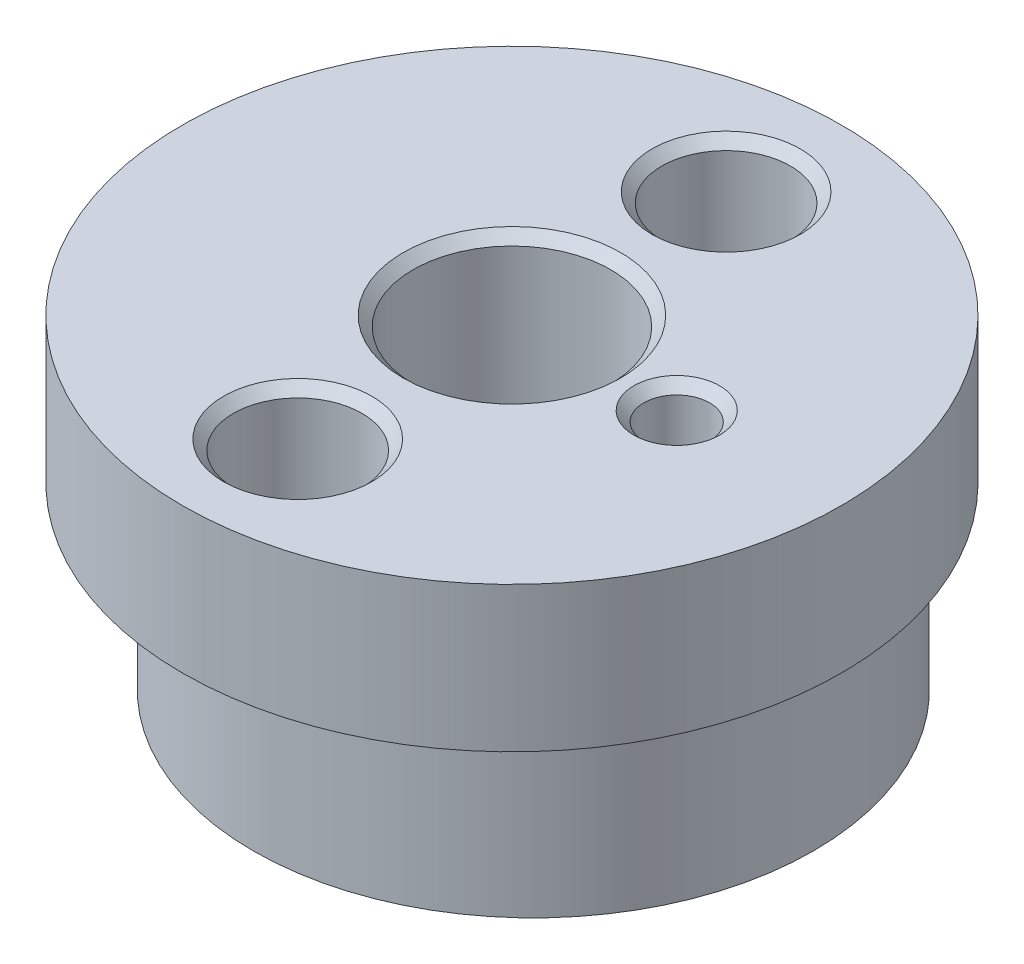
ISO-10303-21;
HEADER;
FILE_DESCRIPTION(('STEP AP214'),'2;1');
FILE_NAME('part.step','',(''),(''),'','','');
FILE_SCHEMA(('AUTOMOTIVE_DESIGN { 1 0 10303 214 1 1 1 1 }'));
ENDSEC;
DATA;
#1=APPLICATION_CONTEXT('core data for automotive mechanical design processes');
#2=APPLICATION_PROTOCOL_DEFINITION('international standard','automotive_design',2000,#1);
#3=PRODUCT_CONTEXT('',#1,'mechanical');
#4=PRODUCT('Part','Part','',(#3));
#5=PRODUCT_RELATED_PRODUCT_CATEGORY('part','',(#4));
#6=PRODUCT_DEFINITION_FORMATION('','',#4);
#7=PRODUCT_DEFINITION_CONTEXT('part definition',#1,'design');
#8=PRODUCT_DEFINITION('design','',#6,#7);
#9=PRODUCT_DEFINITION_SHAPE('','',#8);
#10=(LENGTH_UNIT() NAMED_UNIT(*) SI_UNIT(.MILLI.,.METRE.));
#11=(NAMED_UNIT(*) PLANE_ANGLE_UNIT() SI_UNIT($,.RADIAN.));
#12=(NAMED_UNIT(*) SI_UNIT($,.STERADIAN.) SOLID_ANGLE_UNIT());
#13=UNCERTAINTY_MEASURE_WITH_UNIT(LENGTH_MEASURE(1.E-05),#10,'distance_accuracy_value','');
#14=(GEOMETRIC_REPRESENTATION_CONTEXT(3) GLOBAL_UNCERTAINTY_ASSIGNED_CONTEXT((#13)) GLOBAL_UNIT_ASSIGNED_CONTEXT((#10,
#11,#12)) REPRESENTATION_CONTEXT('',''));
#15=CARTESIAN_POINT('',(0.,0.,0.));
#16=DIRECTION('',(0.,0.,1.));
#17=DIRECTION('',(1.,0.,0.));
#18=AXIS2_PLACEMENT_3D('',#15,#16,#17);
#19=CARTESIAN_POINT('',(-0.65,0.,6.5));
#20=DIRECTION('',(0.,-1.,0.));
#21=DIRECTION('',(0.,0.,-1.));
#22=AXIS2_PLACEMENT_3D('',#19,#20,#21);
#23=CYLINDRICAL_SURFACE('',#22,1.6);
#24=CARTESIAN_POINT('',(-0.65,0.299999999999999,6.5));
#25=DIRECTION('',(0.,1.,0.));
#26=DIRECTION('',(0.,0.,1.));
#27=AXIS2_PLACEMENT_3D('',#24,#25,#26);
#28=CIRCLE('',#27,1.6);
#29=CARTESIAN_POINT('',(-0.65,0.299999999999999,8.1));
#30=VERTEX_POINT('',#29);
#31=EDGE_CURVE('E64',#30,#30,#28,.F.);
#32=ORIENTED_EDGE('',*,*,#31,.T.);
#33=EDGE_LOOP('',(#32));
#34=FACE_BOUND('',#33,.T.);
#35=CARTESIAN_POINT('',(-0.65,5.5,6.5));
#36=DIRECTION('',(0.,1.,0.));
#37=DIRECTION('',(0.,0.,1.));
#38=AXIS2_PLACEMENT_3D('',#35,#36,#37);
#39=CIRCLE('',#38,1.6);
#40=CARTESIAN_POINT('',(-0.65,5.5,8.1));
#41=VERTEX_POINT('',#40);
#42=EDGE_CURVE('E92',#41,#41,#39,.F.);
#43=ORIENTED_EDGE('',*,*,#42,.F.);
#44=EDGE_LOOP('',(#43));
#45=FACE_BOUND('',#44,.T.);
#46=ADVANCED_FACE('F34',(#34,#45),#23,.F.);
#47=CARTESIAN_POINT('',(-0.65,0.,-6.5));
#48=DIRECTION('',(0.,-1.,0.));
#49=DIRECTION('',(0.,0.,-1.));
#50=AXIS2_PLACEMENT_3D('',#47,#48,#49);
#51=CYLINDRICAL_SURFACE('',#50,1.6);
#52=CARTESIAN_POINT('',(-0.65,0.299999999999999,-6.5));
#53=DIRECTION('',(0.,1.,0.));
#54=DIRECTION('',(0.,0.,1.));
#55=AXIS2_PLACEMENT_3D('',#52,#53,#54);
#56=CIRCLE('',#55,1.6);
#57=CARTESIAN_POINT('',(-0.65,0.299999999999999,-4.9));
#58=VERTEX_POINT('',#57);
#59=EDGE_CURVE('E46',#58,#58,#56,.F.);
#60=ORIENTED_EDGE('',*,*,#59,.T.);
#61=EDGE_LOOP('',(#60));
#62=FACE_BOUND('',#61,.T.);
#63=CARTESIAN_POINT('',(-0.65,5.5,-6.5));
#64=DIRECTION('',(0.,1.,0.));
#65=DIRECTION('',(0.,0.,1.));
#66=AXIS2_PLACEMENT_3D('',#63,#64,#65);
#67=CIRCLE('',#66,1.6);
#68=CARTESIAN_POINT('',(-0.65,5.5,-4.9));
#69=VERTEX_POINT('',#68);
#70=EDGE_CURVE('E96',#69,#69,#67,.F.);
#71=ORIENTED_EDGE('',*,*,#70,.F.);
#72=EDGE_LOOP('',(#71));
#73=FACE_BOUND('',#72,.T.);
#74=ADVANCED_FACE('F133',(#62,#73),#51,.F.);
#75=CARTESIAN_POINT('',(0.,0.,0.));
#76=DIRECTION('',(0.,1.,0.));
#77=DIRECTION('',(0.,0.,1.));
#78=AXIS2_PLACEMENT_3D('',#75,#76,#77);
#79=PLANE('',#78);
#80=CARTESIAN_POINT('',(-0.65,0.,6.5));
#81=DIRECTION('',(0.,1.,0.));
#82=DIRECTION('',(0.,0.,1.));
#83=AXIS2_PLACEMENT_3D('',#80,#81,#82);
#84=CIRCLE('',#83,1.9);
#85=CARTESIAN_POINT('',(-0.65,0.,8.4));
#86=VERTEX_POINT('',#85);
#87=EDGE_CURVE('E50',#86,#86,#84,.T.);
#88=ORIENTED_EDGE('',*,*,#87,.T.);
#89=EDGE_LOOP('',(#88));
#90=FACE_BOUND('',#89,.T.);
#91=CARTESIAN_POINT('',(-0.65,0.,-6.5));
#92=DIRECTION('',(0.,1.,0.));
#93=DIRECTION('',(0.,0.,1.));
#94=AXIS2_PLACEMENT_3D('',#91,#92,#93);
#95=CIRCLE('',#94,1.9);
#96=CARTESIAN_POINT('',(-0.65,0.,-4.6));
#97=VERTEX_POINT('',#96);
#98=EDGE_CURVE('E55',#97,#97,#95,.T.);
#99=ORIENTED_EDGE('',*,*,#98,.T.);
#100=EDGE_LOOP('',(#99));
#101=FACE_BOUND('',#100,.T.);
#102=CARTESIAN_POINT('',(-0.65,0.,0.));
#103=DIRECTION('',(0.,1.,0.));
#104=DIRECTION('',(0.,0.,1.));
#105=AXIS2_PLACEMENT_3D('',#102,#103,#104);
#106=CIRCLE('',#105,3.3);
#107=CARTESIAN_POINT('',(-0.65,0.,3.3));
#108=VERTEX_POINT('',#107);
#109=EDGE_CURVE('E58',#108,#108,#106,.T.);
#110=ORIENTED_EDGE('',*,*,#109,.T.);
#111=EDGE_LOOP('',(#110));
#112=FACE_BOUND('',#111,.T.);
#113=CARTESIAN_POINT('',(4.34999999999999,0.,0.));
#114=DIRECTION('',(0.,1.,0.));
#115=DIRECTION('',(0.,0.,1.));
#116=AXIS2_PLACEMENT_3D('',#113,#114,#115);
#117=CIRCLE('',#116,1.30000000000001);
#118=CARTESIAN_POINT('',(4.34999999999999,0.,1.30000000000001));
#119=VERTEX_POINT('',#118);
#120=EDGE_CURVE('E61',#119,#119,#117,.T.);
#121=ORIENTED_EDGE('',*,*,#120,.T.);
#122=EDGE_LOOP('',(#121));
#123=FACE_BOUND('',#122,.T.);
#124=CARTESIAN_POINT('',(0.,0.,0.));
#125=DIRECTION('',(0.,1.,0.));
#126=DIRECTION('',(0.,0.,1.));
#127=AXIS2_PLACEMENT_3D('',#124,#125,#126);
#128=CIRCLE('',#127,8.5);
#129=CARTESIAN_POINT('',(0.,0.,8.5));
#130=VERTEX_POINT('',#129);
#131=EDGE_CURVE('E102',#130,#130,#128,.T.);
#132=ORIENTED_EDGE('',*,*,#131,.F.);
#133=EDGE_LOOP('',(#132));
#134=FACE_BOUND('',#133,.T.);
#135=ADVANCED_FACE('F140',(#90,#101,#112,#123,#134),#79,.F.);
#136=CARTESIAN_POINT('',(0.,5.5,0.));
#137=DIRECTION('',(0.,-1.,0.));
#138=DIRECTION('',(0.,0.,-1.));
#139=AXIS2_PLACEMENT_3D('',#136,#137,#138);
#140=CYLINDRICAL_SURFACE('',#139,8.5);
#141=ORIENTED_EDGE('',*,*,#131,.T.);
#142=EDGE_LOOP('',(#141));
#143=FACE_BOUND('',#142,.T.);
#144=CARTESIAN_POINT('',(0.,5.1,0.));
#145=DIRECTION('',(0.,1.,0.));
#146=DIRECTION('',(0.,0.,1.));
#147=AXIS2_PLACEMENT_3D('',#144,#145,#146);
#148=CIRCLE('',#147,8.5);
#149=CARTESIAN_POINT('',(0.,5.1,8.5));
#150=VERTEX_POINT('',#149);
#151=EDGE_CURVE('E91',#150,#150,#148,.T.);
#152=ORIENTED_EDGE('',*,*,#151,.F.);
#153=EDGE_LOOP('',(#152));
#154=FACE_BOUND('',#153,.T.);
#155=ADVANCED_FACE('F164',(#143,#154),#140,.T.);
#156=CARTESIAN_POINT('',(-0.65,5.1,0.));
#157=DIRECTION('',(0.,1.,0.));
#158=DIRECTION('',(0.,0.,1.));
#159=AXIS2_PLACEMENT_3D('',#156,#157,#158);
#160=CYLINDRICAL_SURFACE('',#159,10.);
#161=CARTESIAN_POINT('',(-0.65,5.1,0.));
#162=DIRECTION('',(0.,1.,0.));
#163=DIRECTION('',(0.,0.,1.));
#164=AXIS2_PLACEMENT_3D('',#161,#162,#163);
#165=CIRCLE('',#164,10.);
#166=CARTESIAN_POINT('',(-0.65,5.1,10.));
#167=VERTEX_POINT('',#166);
#168=EDGE_CURVE('E105',#167,#167,#165,.T.);
#169=ORIENTED_EDGE('',*,*,#168,.T.);
#170=EDGE_LOOP('',(#169));
#171=FACE_BOUND('',#170,.T.);
#172=CARTESIAN_POINT('',(-0.65,9.5,0.));
#173=DIRECTION('',(0.,1.,0.));
#174=DIRECTION('',(0.,0.,1.));
#175=AXIS2_PLACEMENT_3D('',#172,#173,#174);
#176=CIRCLE('',#175,10.);
#177=CARTESIAN_POINT('',(-0.65,9.5,10.));
#178=VERTEX_POINT('',#177);
#179=EDGE_CURVE('E95',#178,#178,#176,.T.);
#180=ORIENTED_EDGE('',*,*,#179,.F.);
#181=EDGE_LOOP('',(#180));
#182=FACE_BOUND('',#181,.T.);
#183=ADVANCED_FACE('F160',(#171,#182),#160,.T.);
#184=CARTESIAN_POINT('',(-0.65,5.1,0.));
#185=DIRECTION('',(0.,1.,0.));
#186=DIRECTION('',(0.,0.,1.));
#187=AXIS2_PLACEMENT_3D('',#184,#185,#186);
#188=PLANE('',#187);
#189=ORIENTED_EDGE('',*,*,#151,.T.);
#190=EDGE_LOOP('',(#189));
#191=FACE_BOUND('',#190,.T.);
#192=ORIENTED_EDGE('',*,*,#168,.F.);
#193=EDGE_LOOP('',(#192));
#194=FACE_BOUND('',#193,.T.);
#195=ADVANCED_FACE('F156',(#191,#194),#188,.F.);
#196=CARTESIAN_POINT('',(-0.65,9.5,0.));
#197=DIRECTION('',(0.,1.,0.));
#198=DIRECTION('',(0.,0.,1.));
#199=AXIS2_PLACEMENT_3D('',#196,#197,#198);
#200=PLANE('',#199);
#201=CARTESIAN_POINT('',(-0.65,9.5,0.));
#202=DIRECTION('',(0.,1.,0.));
#203=DIRECTION('',(0.,0.,1.));
#204=AXIS2_PLACEMENT_3D('',#201,#202,#203);
#205=CIRCLE('',#204,3.30000000000001);
#206=CARTESIAN_POINT('',(-0.65,9.5,3.30000000000001));
#207=VERTEX_POINT('',#206);
#208=EDGE_CURVE('E79',#207,#207,#205,.F.);
#209=ORIENTED_EDGE('',*,*,#208,.T.);
#210=EDGE_LOOP('',(#209));
#211=FACE_BOUND('',#210,.T.);
#212=CARTESIAN_POINT('',(4.34999999999999,9.5,0.));
#213=DIRECTION('',(0.,1.,0.));
#214=DIRECTION('',(0.,0.,1.));
#215=AXIS2_PLACEMENT_3D('',#212,#213,#214);
#216=CIRCLE('',#215,1.30000000000001);
#217=CARTESIAN_POINT('',(4.34999999999999,9.5,1.30000000000001));
#218=VERTEX_POINT('',#217);
#219=EDGE_CURVE('E82',#218,#218,#216,.F.);
#220=ORIENTED_EDGE('',*,*,#219,.T.);
#221=EDGE_LOOP('',(#220));
#222=FACE_BOUND('',#221,.T.);
#223=CARTESIAN_POINT('',(-0.65,9.5,-6.5));
#224=DIRECTION('',(0.,1.,0.));
#225=DIRECTION('',(0.,0.,1.));
#226=AXIS2_PLACEMENT_3D('',#223,#224,#225);
#227=CIRCLE('',#226,2.25);
#228=CARTESIAN_POINT('',(-0.65,9.5,-4.25));
#229=VERTEX_POINT('',#228);
#230=EDGE_CURVE('E85',#229,#229,#227,.F.);
#231=ORIENTED_EDGE('',*,*,#230,.T.);
#232=EDGE_LOOP('',(#231));
#233=FACE_BOUND('',#232,.T.);
#234=CARTESIAN_POINT('',(-0.65,9.5,6.5));
#235=DIRECTION('',(0.,1.,0.));
#236=DIRECTION('',(0.,0.,1.));
#237=AXIS2_PLACEMENT_3D('',#234,#235,#236);
#238=CIRCLE('',#237,2.25);
#239=CARTESIAN_POINT('',(-0.65,9.5,8.75));
#240=VERTEX_POINT('',#239);
#241=EDGE_CURVE('E88',#240,#240,#238,.F.);
#242=ORIENTED_EDGE('',*,*,#241,.T.);
#243=EDGE_LOOP('',(#242));
#244=FACE_BOUND('',#243,.T.);
#245=ORIENTED_EDGE('',*,*,#179,.T.);
#246=EDGE_LOOP('',(#245));
#247=FACE_BOUND('',#246,.T.);
#248=ADVANCED_FACE('F152',(#211,#222,#233,#244,#247),#200,.T.);
#249=CARTESIAN_POINT('',(-0.65,9.5,0.));
#250=DIRECTION('',(0.,-1.,0.));
#251=DIRECTION('',(0.,0.,-1.));
#252=AXIS2_PLACEMENT_3D('',#249,#250,#251);
#253=CYLINDRICAL_SURFACE('',#252,3.);
#254=CARTESIAN_POINT('',(-0.65,9.2,0.));
#255=DIRECTION('',(0.,1.,0.));
#256=DIRECTION('',(0.,0.,1.));
#257=AXIS2_PLACEMENT_3D('',#254,#255,#256);
#258=CIRCLE('',#257,3.);
#259=CARTESIAN_POINT('',(-0.65,9.2,3.));
#260=VERTEX_POINT('',#259);
#261=EDGE_CURVE('E73',#260,#260,#258,.T.);
#262=ORIENTED_EDGE('',*,*,#261,.T.);
#263=EDGE_LOOP('',(#262));
#264=FACE_BOUND('',#263,.T.);
#265=CARTESIAN_POINT('',(-0.65,0.299999999999996,0.));
#266=DIRECTION('',(0.,1.,0.));
#267=DIRECTION('',(0.,0.,1.));
#268=AXIS2_PLACEMENT_3D('',#265,#266,#267);
#269=CIRCLE('',#268,3.);
#270=CARTESIAN_POINT('',(-0.65,0.299999999999996,3.));
#271=VERTEX_POINT('',#270);
#272=EDGE_CURVE('E76',#271,#271,#269,.F.);
#273=ORIENTED_EDGE('',*,*,#272,.T.);
#274=EDGE_LOOP('',(#273));
#275=FACE_BOUND('',#274,.T.);
#276=ADVANCED_FACE('F148',(#264,#275),#253,.F.);
#277=CARTESIAN_POINT('',(4.34999999999999,9.5,0.));
#278=DIRECTION('',(0.,-1.,0.));
#279=DIRECTION('',(0.,0.,-1.));
#280=AXIS2_PLACEMENT_3D('',#277,#278,#279);
#281=CYLINDRICAL_SURFACE('',#280,1.00000000000001);
#282=CARTESIAN_POINT('',(4.34999999999999,9.2,0.));
#283=DIRECTION('',(0.,1.,0.));
#284=DIRECTION('',(0.,0.,1.));
#285=AXIS2_PLACEMENT_3D('',#282,#283,#284);
#286=CIRCLE('',#285,1.00000000000001);
#287=CARTESIAN_POINT('',(4.34999999999999,9.2,1.00000000000001));
#288=VERTEX_POINT('',#287);
#289=EDGE_CURVE('E67',#288,#288,#286,.T.);
#290=ORIENTED_EDGE('',*,*,#289,.T.);
#291=EDGE_LOOP('',(#290));
#292=FACE_BOUND('',#291,.T.);
#293=CARTESIAN_POINT('',(4.34999999999999,0.299999999999993,0.));
#294=DIRECTION('',(0.,1.,0.));
#295=DIRECTION('',(0.,0.,1.));
#296=AXIS2_PLACEMENT_3D('',#293,#294,#295);
#297=CIRCLE('',#296,1.00000000000001);
#298=CARTESIAN_POINT('',(4.34999999999999,0.299999999999993,1.00000000000001));
#299=VERTEX_POINT('',#298);
#300=EDGE_CURVE('E70',#299,#299,#297,.F.);
#301=ORIENTED_EDGE('',*,*,#300,.T.);
#302=EDGE_LOOP('',(#301));
#303=FACE_BOUND('',#302,.T.);
#304=ADVANCED_FACE('F130',(#292,#303),#281,.F.);
#305=CARTESIAN_POINT('',(-0.65,5.5,-6.5));
#306=DIRECTION('',(0.,1.,0.));
#307=DIRECTION('',(0.,0.,1.));
#308=AXIS2_PLACEMENT_3D('',#305,#306,#307);
#309=PLANE('',#308);
#310=CARTESIAN_POINT('',(-0.65,5.5,-6.5));
#311=DIRECTION('',(0.,1.,0.));
#312=DIRECTION('',(0.,0.,1.));
#313=AXIS2_PLACEMENT_3D('',#310,#311,#312);
#314=CIRCLE('',#313,1.95);
#315=CARTESIAN_POINT('',(-0.65,5.5,-4.55));
#316=VERTEX_POINT('',#315);
#317=EDGE_CURVE('E99',#316,#316,#314,.T.);
#318=ORIENTED_EDGE('',*,*,#317,.T.);
#319=EDGE_LOOP('',(#318));
#320=FACE_BOUND('',#319,.T.);
#321=ORIENTED_EDGE('',*,*,#70,.T.);
#322=EDGE_LOOP('',(#321));
#323=FACE_BOUND('',#322,.T.);
#324=ADVANCED_FACE('F116',(#320,#323),#309,.T.);
#325=CARTESIAN_POINT('',(-0.65,5.5,-6.5));
#326=DIRECTION('',(0.,1.,0.));
#327=DIRECTION('',(0.,0.,1.));
#328=AXIS2_PLACEMENT_3D('',#325,#326,#327);
#329=CYLINDRICAL_SURFACE('',#328,1.95);
#330=CARTESIAN_POINT('',(-0.65,9.2,-6.5));
#331=DIRECTION('',(0.,1.,0.));
#332=DIRECTION('',(0.,0.,1.));
#333=AXIS2_PLACEMENT_3D('',#330,#331,#332);
#334=CIRCLE('',#333,1.95);
#335=CARTESIAN_POINT('',(-0.65,9.2,-4.55));
#336=VERTEX_POINT('',#335);
#337=EDGE_CURVE('E42',#336,#336,#334,.T.);
#338=ORIENTED_EDGE('',*,*,#337,.T.);
#339=EDGE_LOOP('',(#338));
#340=FACE_BOUND('',#339,.T.);
#341=ORIENTED_EDGE('',*,*,#317,.F.);
#342=EDGE_LOOP('',(#341));
#343=FACE_BOUND('',#342,.T.);
#344=ADVANCED_FACE('F119',(#340,#343),#329,.F.);
#345=CARTESIAN_POINT('',(-0.65,5.5,6.5));
#346=DIRECTION('',(0.,1.,0.));
#347=DIRECTION('',(0.,0.,1.));
#348=AXIS2_PLACEMENT_3D('',#345,#346,#347);
#349=PLANE('',#348);
#350=CARTESIAN_POINT('',(-0.65,5.5,6.5));
#351=DIRECTION('',(0.,1.,0.));
#352=DIRECTION('',(0.,0.,1.));
#353=AXIS2_PLACEMENT_3D('',#350,#351,#352);
#354=CIRCLE('',#353,1.95);
#355=CARTESIAN_POINT('',(-0.65,5.5,8.45));
#356=VERTEX_POINT('',#355);
#357=EDGE_CURVE('E110',#356,#356,#354,.T.);
#358=ORIENTED_EDGE('',*,*,#357,.T.);
#359=EDGE_LOOP('',(#358));
#360=FACE_BOUND('',#359,.T.);
#361=ORIENTED_EDGE('',*,*,#42,.T.);
#362=EDGE_LOOP('',(#361));
#363=FACE_BOUND('',#362,.T.);
#364=ADVANCED_FACE('F121',(#360,#363),#349,.T.);
#365=CARTESIAN_POINT('',(-0.65,5.5,6.5));
#366=DIRECTION('',(0.,1.,0.));
#367=DIRECTION('',(0.,0.,1.));
#368=AXIS2_PLACEMENT_3D('',#365,#366,#367);
#369=CYLINDRICAL_SURFACE('',#368,1.95);
#370=CARTESIAN_POINT('',(-0.65,9.2,6.5));
#371=DIRECTION('',(0.,1.,0.));
#372=DIRECTION('',(0.,0.,1.));
#373=AXIS2_PLACEMENT_3D('',#370,#371,#372);
#374=CIRCLE('',#373,1.95);
#375=CARTESIAN_POINT('',(-0.65,9.2,8.45));
#376=VERTEX_POINT('',#375);
#377=EDGE_CURVE('E10',#376,#376,#374,.T.);
#378=ORIENTED_EDGE('',*,*,#377,.T.);
#379=EDGE_LOOP('',(#378));
#380=FACE_BOUND('',#379,.T.);
#381=ORIENTED_EDGE('',*,*,#357,.F.);
#382=EDGE_LOOP('',(#381));
#383=FACE_BOUND('',#382,.T.);
#384=ADVANCED_FACE('F127',(#380,#383),#369,.F.);
#385=CARTESIAN_POINT('',(-0.65,9.5,0.));
#386=DIRECTION('',(0.,1.,0.));
#387=DIRECTION('',(0.,0.,1.));
#388=AXIS2_PLACEMENT_3D('',#385,#386,#387);
#389=CONICAL_SURFACE('',#388,3.30000000000001,0.785398163397455);
#390=ORIENTED_EDGE('',*,*,#261,.F.);
#391=EDGE_LOOP('',(#390));
#392=FACE_BOUND('',#391,.T.);
#393=ORIENTED_EDGE('',*,*,#208,.F.);
#394=EDGE_LOOP('',(#393));
#395=FACE_BOUND('',#394,.T.);
#396=ADVANCED_FACE('F173',(#392,#395),#389,.F.);
#397=CARTESIAN_POINT('',(4.34999999999999,9.5,0.));
#398=DIRECTION('',(0.,1.,0.));
#399=DIRECTION('',(0.,0.,1.));
#400=AXIS2_PLACEMENT_3D('',#397,#398,#399);
#401=CONICAL_SURFACE('',#400,1.30000000000001,0.785398163397448);
#402=ORIENTED_EDGE('',*,*,#289,.F.);
#403=EDGE_LOOP('',(#402));
#404=FACE_BOUND('',#403,.T.);
#405=ORIENTED_EDGE('',*,*,#219,.F.);
#406=EDGE_LOOP('',(#405));
#407=FACE_BOUND('',#406,.T.);
#408=ADVANCED_FACE('F179',(#404,#407),#401,.F.);
#409=CARTESIAN_POINT('',(-0.65,0.299999999999999,6.5));
#410=DIRECTION('',(0.,-1.,0.));
#411=DIRECTION('',(0.,0.,-1.));
#412=AXIS2_PLACEMENT_3D('',#409,#410,#411);
#413=CONICAL_SURFACE('',#412,1.6,0.785398163397452);
#414=ORIENTED_EDGE('',*,*,#87,.F.);
#415=EDGE_LOOP('',(#414));
#416=FACE_BOUND('',#415,.T.);
#417=ORIENTED_EDGE('',*,*,#31,.F.);
#418=EDGE_LOOP('',(#417));
#419=FACE_BOUND('',#418,.T.);
#420=ADVANCED_FACE('F186',(#416,#419),#413,.F.);
#421=CARTESIAN_POINT('',(-0.65,0.299999999999999,-6.5));
#422=DIRECTION('',(0.,-1.,0.));
#423=DIRECTION('',(0.,0.,-1.));
#424=AXIS2_PLACEMENT_3D('',#421,#422,#423);
#425=CONICAL_SURFACE('',#424,1.6,0.78539816339745);
#426=ORIENTED_EDGE('',*,*,#98,.F.);
#427=EDGE_LOOP('',(#426));
#428=FACE_BOUND('',#427,.T.);
#429=ORIENTED_EDGE('',*,*,#59,.F.);
#430=EDGE_LOOP('',(#429));
#431=FACE_BOUND('',#430,.T.);
#432=ADVANCED_FACE('F193',(#428,#431),#425,.F.);
#433=CARTESIAN_POINT('',(-0.65,0.299999999999996,0.));
#434=DIRECTION('',(0.,-1.,0.));
#435=DIRECTION('',(0.,0.,-1.));
#436=AXIS2_PLACEMENT_3D('',#433,#434,#435);
#437=CONICAL_SURFACE('',#436,3.,0.785398163397455);
#438=ORIENTED_EDGE('',*,*,#109,.F.);
#439=EDGE_LOOP('',(#438));
#440=FACE_BOUND('',#439,.T.);
#441=ORIENTED_EDGE('',*,*,#272,.F.);
#442=EDGE_LOOP('',(#441));
#443=FACE_BOUND('',#442,.T.);
#444=ADVANCED_FACE('F200',(#440,#443),#437,.F.);
#445=CARTESIAN_POINT('',(4.34999999999999,0.299999999999993,0.));
#446=DIRECTION('',(0.,-1.,0.));
#447=DIRECTION('',(0.,0.,-1.));
#448=AXIS2_PLACEMENT_3D('',#445,#446,#447);
#449=CONICAL_SURFACE('',#448,1.00000000000001,0.785398163397448);
#450=ORIENTED_EDGE('',*,*,#120,.F.);
#451=EDGE_LOOP('',(#450));
#452=FACE_BOUND('',#451,.T.);
#453=ORIENTED_EDGE('',*,*,#300,.F.);
#454=EDGE_LOOP('',(#453));
#455=FACE_BOUND('',#454,.T.);
#456=ADVANCED_FACE('F207',(#452,#455),#449,.F.);
#457=CARTESIAN_POINT('',(-0.65,9.2,-6.5));
#458=DIRECTION('',(0.,1.,0.));
#459=DIRECTION('',(0.,0.,1.));
#460=AXIS2_PLACEMENT_3D('',#457,#458,#459);
#461=CONICAL_SURFACE('',#460,1.95,0.78539816339745);
#462=ORIENTED_EDGE('',*,*,#230,.F.);
#463=EDGE_LOOP('',(#462));
#464=FACE_BOUND('',#463,.T.);
#465=ORIENTED_EDGE('',*,*,#337,.F.);
#466=EDGE_LOOP('',(#465));
#467=FACE_BOUND('',#466,.T.);
#468=ADVANCED_FACE('F213',(#464,#467),#461,.F.);
#469=CARTESIAN_POINT('',(-0.65,9.2,6.5));
#470=DIRECTION('',(0.,1.,0.));
#471=DIRECTION('',(0.,0.,1.));
#472=AXIS2_PLACEMENT_3D('',#469,#470,#471);
#473=CONICAL_SURFACE('',#472,1.95,0.785398163397452);
#474=ORIENTED_EDGE('',*,*,#241,.F.);
#475=EDGE_LOOP('',(#474));
#476=FACE_BOUND('',#475,.T.);
#477=ORIENTED_EDGE('',*,*,#377,.F.);
#478=EDGE_LOOP('',(#477));
#479=FACE_BOUND('',#478,.T.);
#480=ADVANCED_FACE('F37',(#476,#479),#473,.F.);
#481=CLOSED_SHELL('',(#46,#74,#135,#155,#183,#195,#248,#276,#304,#324,#344,#364,#384,#396,#408,
#420,#432,#444,#456,#468,#480));
#482=MANIFOLD_SOLID_BREP('B2',#481);
#483=ADVANCED_BREP_SHAPE_REPRESENTATION('',(#18,#482),#14);
#484=SHAPE_DEFINITION_REPRESENTATION(#9,#483);
ENDSEC;
END-ISO-10303-21;
